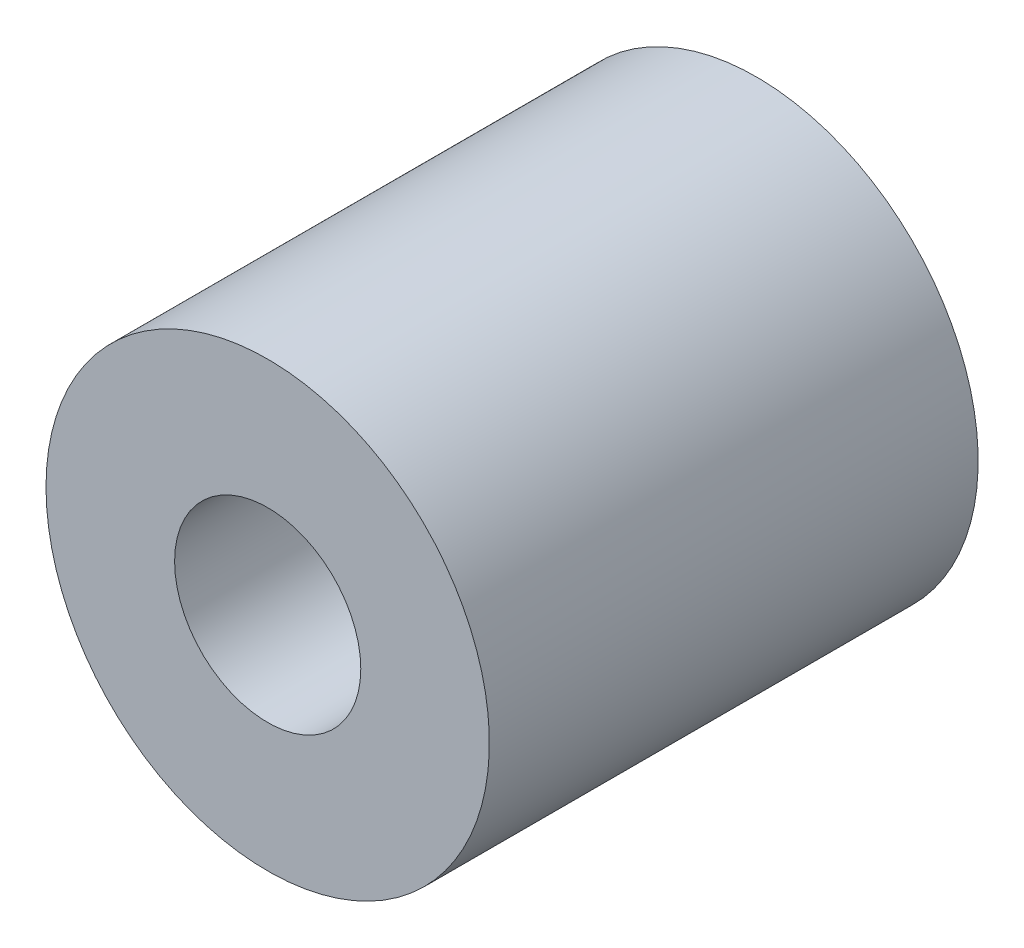
ISO-10303-21;
HEADER;
FILE_DESCRIPTION(('STEP AP214'),'2;1');
FILE_NAME('part.step','',(''),(''),'','','');
FILE_SCHEMA(('AUTOMOTIVE_DESIGN { 1 0 10303 214 1 1 1 1 }'));
ENDSEC;
DATA;
#1=APPLICATION_CONTEXT('core data for automotive mechanical design processes');
#2=APPLICATION_PROTOCOL_DEFINITION('international standard','automotive_design',2000,#1);
#3=PRODUCT_CONTEXT('',#1,'mechanical');
#4=PRODUCT('Part','Part','',(#3));
#5=PRODUCT_RELATED_PRODUCT_CATEGORY('part','',(#4));
#6=PRODUCT_DEFINITION_FORMATION('','',#4);
#7=PRODUCT_DEFINITION_CONTEXT('part definition',#1,'design');
#8=PRODUCT_DEFINITION('design','',#6,#7);
#9=PRODUCT_DEFINITION_SHAPE('','',#8);
#10=(LENGTH_UNIT() NAMED_UNIT(*) SI_UNIT(.MILLI.,.METRE.));
#11=(NAMED_UNIT(*) PLANE_ANGLE_UNIT() SI_UNIT($,.RADIAN.));
#12=(NAMED_UNIT(*) SI_UNIT($,.STERADIAN.) SOLID_ANGLE_UNIT());
#13=UNCERTAINTY_MEASURE_WITH_UNIT(LENGTH_MEASURE(1.E-05),#10,'distance_accuracy_value','');
#14=(GEOMETRIC_REPRESENTATION_CONTEXT(3) GLOBAL_UNCERTAINTY_ASSIGNED_CONTEXT((#13)) GLOBAL_UNIT_ASSIGNED_CONTEXT((#10,
#11,#12)) REPRESENTATION_CONTEXT('',''));
#15=CARTESIAN_POINT('',(0.,0.,0.));
#16=DIRECTION('',(0.,0.,1.));
#17=DIRECTION('',(1.,0.,0.));
#18=AXIS2_PLACEMENT_3D('',#15,#16,#17);
#19=CARTESIAN_POINT('',(0.,0.,21.));
#20=DIRECTION('',(0.,0.,1.));
#21=DIRECTION('',(1.,0.,0.));
#22=AXIS2_PLACEMENT_3D('',#19,#20,#21);
#23=PLANE('',#22);
#24=CARTESIAN_POINT('',(0.,0.,21.));
#25=DIRECTION('',(0.,0.,1.));
#26=DIRECTION('',(1.,0.,0.));
#27=AXIS2_PLACEMENT_3D('',#24,#25,#26);
#28=CIRCLE('',#27,9.525);
#29=CARTESIAN_POINT('',(-9.525,0.,21.));
#30=VERTEX_POINT('',#29);
#31=EDGE_CURVE('E10',#30,#30,#28,.T.);
#32=ORIENTED_EDGE('',*,*,#31,.T.);
#33=EDGE_LOOP('',(#32));
#34=FACE_BOUND('',#33,.T.);
#35=CARTESIAN_POINT('',(0.,0.,21.));
#36=DIRECTION('',(0.,0.,1.));
#37=DIRECTION('',(1.,0.,0.));
#38=AXIS2_PLACEMENT_3D('',#35,#36,#37);
#39=CIRCLE('',#38,4.);
#40=CARTESIAN_POINT('',(-4.,0.,21.));
#41=VERTEX_POINT('',#40);
#42=EDGE_CURVE('E42',#41,#41,#39,.T.);
#43=ORIENTED_EDGE('',*,*,#42,.F.);
#44=EDGE_LOOP('',(#43));
#45=FACE_BOUND('',#44,.T.);
#46=ADVANCED_FACE('F31',(#34,#45),#23,.T.);
#47=CARTESIAN_POINT('',(0.,0.,0.));
#48=DIRECTION('',(0.,0.,1.));
#49=DIRECTION('',(1.,0.,0.));
#50=AXIS2_PLACEMENT_3D('',#47,#48,#49);
#51=PLANE('',#50);
#52=CARTESIAN_POINT('',(0.,0.,0.));
#53=DIRECTION('',(0.,0.,1.));
#54=DIRECTION('',(1.,0.,0.));
#55=AXIS2_PLACEMENT_3D('',#52,#53,#54);
#56=CIRCLE('',#55,9.525);
#57=CARTESIAN_POINT('',(-9.525,0.,0.));
#58=VERTEX_POINT('',#57);
#59=EDGE_CURVE('E35',#58,#58,#56,.T.);
#60=ORIENTED_EDGE('',*,*,#59,.F.);
#61=EDGE_LOOP('',(#60));
#62=FACE_BOUND('',#61,.T.);
#63=CARTESIAN_POINT('',(0.,0.,0.));
#64=DIRECTION('',(0.,0.,1.));
#65=DIRECTION('',(1.,0.,0.));
#66=AXIS2_PLACEMENT_3D('',#63,#64,#65);
#67=CIRCLE('',#66,4.);
#68=CARTESIAN_POINT('',(-4.,0.,0.));
#69=VERTEX_POINT('',#68);
#70=EDGE_CURVE('E44',#69,#69,#67,.T.);
#71=ORIENTED_EDGE('',*,*,#70,.T.);
#72=EDGE_LOOP('',(#71));
#73=FACE_BOUND('',#72,.T.);
#74=ADVANCED_FACE('F54',(#62,#73),#51,.F.);
#75=CARTESIAN_POINT('',(0.,0.,21.));
#76=DIRECTION('',(0.,0.,-1.));
#77=DIRECTION('',(-1.,0.,0.));
#78=AXIS2_PLACEMENT_3D('',#75,#76,#77);
#79=CYLINDRICAL_SURFACE('',#78,9.525);
#80=CARTESIAN_POINT('',(-9.525,0.,21.));
#81=CARTESIAN_POINT('',(-9.525,0.,20.78125));
#82=CARTESIAN_POINT('',(-9.525,0.,20.5625));
#83=CARTESIAN_POINT('',(-9.525,0.,20.125));
#84=CARTESIAN_POINT('',(-9.525,0.,19.90625));
#85=CARTESIAN_POINT('',(-9.525,0.,19.46875));
#86=CARTESIAN_POINT('',(-9.525,0.,19.25));
#87=CARTESIAN_POINT('',(-9.525,0.,18.8125));
#88=CARTESIAN_POINT('',(-9.525,0.,18.59375));
#89=CARTESIAN_POINT('',(-9.525,0.,18.15625));
#90=CARTESIAN_POINT('',(-9.525,0.,17.9375));
#91=CARTESIAN_POINT('',(-9.525,0.,17.5));
#92=CARTESIAN_POINT('',(-9.525,0.,17.28125));
#93=CARTESIAN_POINT('',(-9.525,0.,16.84375));
#94=CARTESIAN_POINT('',(-9.525,0.,16.625));
#95=CARTESIAN_POINT('',(-9.525,0.,16.1875));
#96=CARTESIAN_POINT('',(-9.525,0.,15.96875));
#97=CARTESIAN_POINT('',(-9.525,0.,15.53125));
#98=CARTESIAN_POINT('',(-9.525,0.,15.3125));
#99=CARTESIAN_POINT('',(-9.525,0.,14.875));
#100=CARTESIAN_POINT('',(-9.525,0.,14.65625));
#101=CARTESIAN_POINT('',(-9.525,0.,14.21875));
#102=CARTESIAN_POINT('',(-9.525,0.,14.));
#103=CARTESIAN_POINT('',(-9.525,0.,13.5625));
#104=CARTESIAN_POINT('',(-9.525,0.,13.34375));
#105=CARTESIAN_POINT('',(-9.525,0.,12.90625));
#106=CARTESIAN_POINT('',(-9.525,0.,12.6875));
#107=CARTESIAN_POINT('',(-9.525,0.,12.25));
#108=CARTESIAN_POINT('',(-9.525,0.,12.03125));
#109=CARTESIAN_POINT('',(-9.525,0.,11.59375));
#110=CARTESIAN_POINT('',(-9.525,0.,11.375));
#111=CARTESIAN_POINT('',(-9.525,0.,10.9375));
#112=CARTESIAN_POINT('',(-9.525,0.,10.71875));
#113=CARTESIAN_POINT('',(-9.525,0.,10.28125));
#114=CARTESIAN_POINT('',(-9.525,0.,10.0625));
#115=CARTESIAN_POINT('',(-9.525,0.,9.625));
#116=CARTESIAN_POINT('',(-9.525,0.,9.40625));
#117=CARTESIAN_POINT('',(-9.525,0.,8.96875));
#118=CARTESIAN_POINT('',(-9.525,0.,8.75));
#119=CARTESIAN_POINT('',(-9.525,0.,8.3125));
#120=CARTESIAN_POINT('',(-9.525,0.,8.09375));
#121=CARTESIAN_POINT('',(-9.525,0.,7.65625));
#122=CARTESIAN_POINT('',(-9.525,0.,7.4375));
#123=CARTESIAN_POINT('',(-9.525,0.,7.));
#124=CARTESIAN_POINT('',(-9.525,0.,6.78125));
#125=CARTESIAN_POINT('',(-9.525,0.,6.34375));
#126=CARTESIAN_POINT('',(-9.525,0.,6.125));
#127=CARTESIAN_POINT('',(-9.525,0.,5.6875));
#128=CARTESIAN_POINT('',(-9.525,0.,5.46875));
#129=CARTESIAN_POINT('',(-9.525,0.,5.03125));
#130=CARTESIAN_POINT('',(-9.525,0.,4.8125));
#131=CARTESIAN_POINT('',(-9.525,0.,4.375));
#132=CARTESIAN_POINT('',(-9.525,0.,4.15625));
#133=CARTESIAN_POINT('',(-9.525,0.,3.71875));
#134=CARTESIAN_POINT('',(-9.525,0.,3.5));
#135=CARTESIAN_POINT('',(-9.525,0.,3.0625));
#136=CARTESIAN_POINT('',(-9.525,0.,2.84375));
#137=CARTESIAN_POINT('',(-9.525,0.,2.40625));
#138=CARTESIAN_POINT('',(-9.525,0.,2.1875));
#139=CARTESIAN_POINT('',(-9.525,0.,1.75));
#140=CARTESIAN_POINT('',(-9.525,0.,1.53125));
#141=CARTESIAN_POINT('',(-9.525,0.,1.09375));
#142=CARTESIAN_POINT('',(-9.525,0.,0.875000000000001));
#143=CARTESIAN_POINT('',(-9.525,0.,0.4375));
#144=CARTESIAN_POINT('',(-9.525,0.,0.21875));
#145=CARTESIAN_POINT('',(-9.525,0.,0.));
#146=B_SPLINE_CURVE_WITH_KNOTS('',3,(#80,#81,#82,#83,#84,#85,#86,#87,#88,#89,#90,#91,#92,#93,
#94,#95,#96,#97,#98,#99,#100,#101,#102,#103,#104,#105,#106,#107,#108,#109,#110,#111,#112,#113,
#114,#115,#116,#117,#118,#119,#120,#121,#122,#123,#124,#125,#126,#127,#128,#129,#130,#131,#132,
#133,#134,#135,#136,#137,#138,#139,#140,#141,#142,#143,#144,#145),.UNSPECIFIED.,.F.,.F.,(4,2,2,
2,2,2,2,2,2,2,2,2,2,2,2,2,2,2,2,2,2,2,2,2,2,2,2,2,2,2,2,2,4),(0.,0.656249999999997,1.3125,
1.96875,2.625,3.28125,3.9375,4.59375,5.25,5.90625,6.5625,7.21875,7.875,8.53125,9.1875,9.84375,
10.5,11.15625,11.8125,12.46875,13.125,13.78125,14.4375,15.09375,15.75,16.40625,17.0625,17.71875,
18.375,19.03125,19.6875,20.34375,21.),.UNSPECIFIED.);
#147=EDGE_CURVE('BSEAM33',#30,#58,#146,.T.);
#148=ORIENTED_EDGE('',*,*,#31,.F.);
#149=ORIENTED_EDGE('',*,*,#59,.T.);
#150=ORIENTED_EDGE('',*,*,#147,.T.);
#151=ORIENTED_EDGE('',*,*,#147,.F.);
#152=EDGE_LOOP('',(#148,#150,#149,#151));
#153=FACE_BOUND('',#152,.T.);
#154=ADVANCED_FACE('F33',(#153),#79,.T.);
#155=CARTESIAN_POINT('',(0.,0.,21.));
#156=DIRECTION('',(0.,0.,-1.));
#157=DIRECTION('',(-1.,0.,0.));
#158=AXIS2_PLACEMENT_3D('',#155,#156,#157);
#159=CYLINDRICAL_SURFACE('',#158,4.);
#160=CARTESIAN_POINT('',(-4.,0.,21.));
#161=CARTESIAN_POINT('',(-4.,0.,20.78125));
#162=CARTESIAN_POINT('',(-4.,0.,20.5625));
#163=CARTESIAN_POINT('',(-4.,0.,20.125));
#164=CARTESIAN_POINT('',(-4.,0.,19.90625));
#165=CARTESIAN_POINT('',(-4.,0.,19.46875));
#166=CARTESIAN_POINT('',(-4.,0.,19.25));
#167=CARTESIAN_POINT('',(-4.,0.,18.8125));
#168=CARTESIAN_POINT('',(-4.,0.,18.59375));
#169=CARTESIAN_POINT('',(-4.,0.,18.15625));
#170=CARTESIAN_POINT('',(-4.,0.,17.9375));
#171=CARTESIAN_POINT('',(-4.,0.,17.5));
#172=CARTESIAN_POINT('',(-4.,0.,17.28125));
#173=CARTESIAN_POINT('',(-4.,0.,16.84375));
#174=CARTESIAN_POINT('',(-4.,0.,16.625));
#175=CARTESIAN_POINT('',(-4.,0.,16.1875));
#176=CARTESIAN_POINT('',(-4.,0.,15.96875));
#177=CARTESIAN_POINT('',(-4.,0.,15.53125));
#178=CARTESIAN_POINT('',(-4.,0.,15.3125));
#179=CARTESIAN_POINT('',(-4.,0.,14.875));
#180=CARTESIAN_POINT('',(-4.,0.,14.65625));
#181=CARTESIAN_POINT('',(-4.,0.,14.21875));
#182=CARTESIAN_POINT('',(-4.,0.,14.));
#183=CARTESIAN_POINT('',(-4.,0.,13.5625));
#184=CARTESIAN_POINT('',(-4.,0.,13.34375));
#185=CARTESIAN_POINT('',(-4.,0.,12.90625));
#186=CARTESIAN_POINT('',(-4.,0.,12.6875));
#187=CARTESIAN_POINT('',(-4.,0.,12.25));
#188=CARTESIAN_POINT('',(-4.,0.,12.03125));
#189=CARTESIAN_POINT('',(-4.,0.,11.59375));
#190=CARTESIAN_POINT('',(-4.,0.,11.375));
#191=CARTESIAN_POINT('',(-4.,0.,10.9375));
#192=CARTESIAN_POINT('',(-4.,0.,10.71875));
#193=CARTESIAN_POINT('',(-4.,0.,10.28125));
#194=CARTESIAN_POINT('',(-4.,0.,10.0625));
#195=CARTESIAN_POINT('',(-4.,0.,9.625));
#196=CARTESIAN_POINT('',(-4.,0.,9.40625));
#197=CARTESIAN_POINT('',(-4.,0.,8.96875));
#198=CARTESIAN_POINT('',(-4.,0.,8.75));
#199=CARTESIAN_POINT('',(-4.,0.,8.3125));
#200=CARTESIAN_POINT('',(-4.,0.,8.09375));
#201=CARTESIAN_POINT('',(-4.,0.,7.65625));
#202=CARTESIAN_POINT('',(-4.,0.,7.4375));
#203=CARTESIAN_POINT('',(-4.,0.,7.));
#204=CARTESIAN_POINT('',(-4.,0.,6.78125));
#205=CARTESIAN_POINT('',(-4.,0.,6.34375));
#206=CARTESIAN_POINT('',(-4.,0.,6.125));
#207=CARTESIAN_POINT('',(-4.,0.,5.6875));
#208=CARTESIAN_POINT('',(-4.,0.,5.46875));
#209=CARTESIAN_POINT('',(-4.,0.,5.03125));
#210=CARTESIAN_POINT('',(-4.,0.,4.8125));
#211=CARTESIAN_POINT('',(-4.,0.,4.375));
#212=CARTESIAN_POINT('',(-4.,0.,4.15625));
#213=CARTESIAN_POINT('',(-4.,0.,3.71875));
#214=CARTESIAN_POINT('',(-4.,0.,3.5));
#215=CARTESIAN_POINT('',(-4.,0.,3.0625));
#216=CARTESIAN_POINT('',(-4.,0.,2.84375));
#217=CARTESIAN_POINT('',(-4.,0.,2.40625));
#218=CARTESIAN_POINT('',(-4.,0.,2.1875));
#219=CARTESIAN_POINT('',(-4.,0.,1.75));
#220=CARTESIAN_POINT('',(-4.,0.,1.53125));
#221=CARTESIAN_POINT('',(-4.,0.,1.09375));
#222=CARTESIAN_POINT('',(-4.,0.,0.875000000000001));
#223=CARTESIAN_POINT('',(-4.,0.,0.4375));
#224=CARTESIAN_POINT('',(-4.,0.,0.21875));
#225=CARTESIAN_POINT('',(-4.,0.,0.));
#226=B_SPLINE_CURVE_WITH_KNOTS('',3,(#160,#161,#162,#163,#164,#165,#166,#167,#168,#169,#170,
#171,#172,#173,#174,#175,#176,#177,#178,#179,#180,#181,#182,#183,#184,#185,#186,#187,#188,#189,
#190,#191,#192,#193,#194,#195,#196,#197,#198,#199,#200,#201,#202,#203,#204,#205,#206,#207,#208,
#209,#210,#211,#212,#213,#214,#215,#216,#217,#218,#219,#220,#221,#222,#223,#224,#225),
.UNSPECIFIED.,.F.,.F.,(4,2,2,2,2,2,2,2,2,2,2,2,2,2,2,2,2,2,2,2,2,2,2,2,2,2,2,2,2,2,2,2,4),(0.,
0.656249999999997,1.3125,1.96875,2.625,3.28125,3.9375,4.59375,5.25,5.90625,6.5625,7.21875,7.875,
8.53125,9.1875,9.84375,10.5,11.15625,11.8125,12.46875,13.125,13.78125,14.4375,15.09375,15.75,
16.40625,17.0625,17.71875,18.375,19.03125,19.6875,20.34375,21.),.UNSPECIFIED.);
#227=EDGE_CURVE('BSEAM50',#41,#69,#226,.T.);
#228=ORIENTED_EDGE('',*,*,#42,.T.);
#229=ORIENTED_EDGE('',*,*,#70,.F.);
#230=ORIENTED_EDGE('',*,*,#227,.T.);
#231=ORIENTED_EDGE('',*,*,#227,.F.);
#232=EDGE_LOOP('',(#228,#230,#229,#231));
#233=FACE_BOUND('',#232,.T.);
#234=ADVANCED_FACE('F50',(#233),#159,.F.);
#235=CLOSED_SHELL('',(#46,#74,#154,#234));
#236=MANIFOLD_SOLID_BREP('B2',#235);
#237=ADVANCED_BREP_SHAPE_REPRESENTATION('',(#18,#236),#14);
#238=SHAPE_DEFINITION_REPRESENTATION(#9,#237);
ENDSEC;
END-ISO-10303-21;
